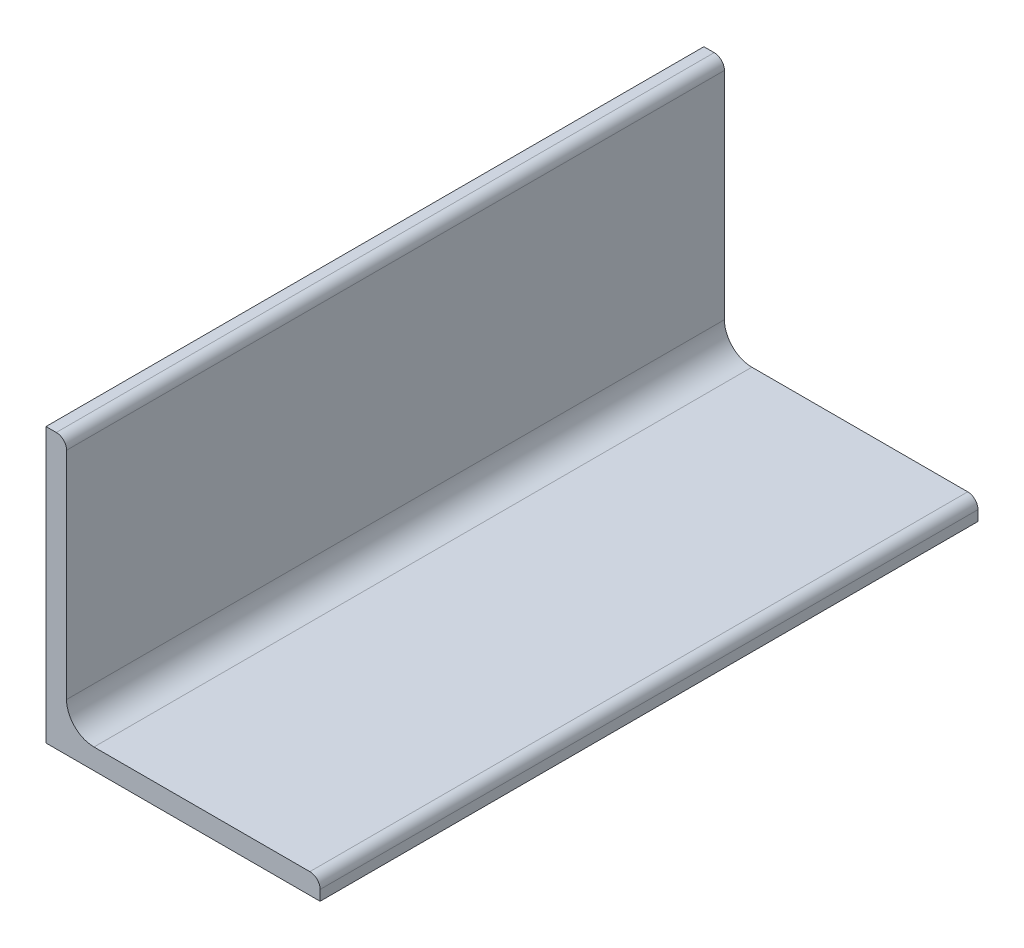
ISO-10303-21;
HEADER;
FILE_DESCRIPTION(('STEP AP214'),'2;1');
FILE_NAME('part.step','',(''),(''),'','','');
FILE_SCHEMA(('AUTOMOTIVE_DESIGN { 1 0 10303 214 1 1 1 1 }'));
ENDSEC;
DATA;
#1=APPLICATION_CONTEXT('core data for automotive mechanical design processes');
#2=APPLICATION_PROTOCOL_DEFINITION('international standard','automotive_design',2000,#1);
#3=PRODUCT_CONTEXT('',#1,'mechanical');
#4=PRODUCT('Part','Part','',(#3));
#5=PRODUCT_RELATED_PRODUCT_CATEGORY('part','',(#4));
#6=PRODUCT_DEFINITION_FORMATION('','',#4);
#7=PRODUCT_DEFINITION_CONTEXT('part definition',#1,'design');
#8=PRODUCT_DEFINITION('design','',#6,#7);
#9=PRODUCT_DEFINITION_SHAPE('','',#8);
#10=(LENGTH_UNIT() NAMED_UNIT(*) SI_UNIT(.MILLI.,.METRE.));
#11=(NAMED_UNIT(*) PLANE_ANGLE_UNIT() SI_UNIT($,.RADIAN.));
#12=(NAMED_UNIT(*) SI_UNIT($,.STERADIAN.) SOLID_ANGLE_UNIT());
#13=UNCERTAINTY_MEASURE_WITH_UNIT(LENGTH_MEASURE(1.E-05),#10,'distance_accuracy_value','');
#14=(GEOMETRIC_REPRESENTATION_CONTEXT(3) GLOBAL_UNCERTAINTY_ASSIGNED_CONTEXT((#13)) GLOBAL_UNIT_ASSIGNED_CONTEXT((#10,
#11,#12)) REPRESENTATION_CONTEXT('',''));
#15=CARTESIAN_POINT('',(0.,0.,0.));
#16=DIRECTION('',(0.,0.,1.));
#17=DIRECTION('',(1.,0.,0.));
#18=AXIS2_PLACEMENT_3D('',#15,#16,#17);
#19=CARTESIAN_POINT('',(0.0507450451214936,127.041655270204,304.8));
#20=DIRECTION('',(1.,0.,0.));
#21=DIRECTION('',(0.,0.,-1.));
#22=AXIS2_PLACEMENT_3D('',#19,#20,#21);
#23=PLANE('',#22);
#24=DIRECTION('',(0.,-1.,0.));
#25=VECTOR('',#24,1.);
#26=CARTESIAN_POINT('',(0.0507450451214936,127.041655270204,0.));
#27=LINE('',#26,#25);
#28=CARTESIAN_POINT('',(0.0507450451214936,127.041655270204,0.));
#29=VERTEX_POINT('',#28);
#30=CARTESIAN_POINT('',(0.0507450451214936,0.0416552702040917,0.));
#31=VERTEX_POINT('',#30);
#32=EDGE_CURVE('E135',#29,#31,#27,.T.);
#33=ORIENTED_EDGE('',*,*,#32,.T.);
#34=DIRECTION('',(0.,0.,-1.));
#35=VECTOR('',#34,1.);
#36=CARTESIAN_POINT('',(0.0507450451214936,0.0416552702040917,304.8));
#37=LINE('',#36,#35);
#38=CARTESIAN_POINT('',(0.0507450451214936,0.0416552702040917,304.8));
#39=VERTEX_POINT('',#38);
#40=EDGE_CURVE('E11',#39,#31,#37,.T.);
#41=ORIENTED_EDGE('',*,*,#40,.F.);
#42=DIRECTION('',(0.,-1.,0.));
#43=VECTOR('',#42,1.);
#44=CARTESIAN_POINT('',(0.0507450451214936,127.041655270204,304.8));
#45=LINE('',#44,#43);
#46=CARTESIAN_POINT('',(0.0507450451214936,127.041655270204,304.8));
#47=VERTEX_POINT('',#46);
#48=EDGE_CURVE('E151',#47,#39,#45,.T.);
#49=ORIENTED_EDGE('',*,*,#48,.F.);
#50=DIRECTION('',(0.,0.,-1.));
#51=VECTOR('',#50,1.);
#52=CARTESIAN_POINT('',(0.0507450451214936,127.041655270204,304.8));
#53=LINE('',#52,#51);
#54=EDGE_CURVE('E131',#47,#29,#53,.T.);
#55=ORIENTED_EDGE('',*,*,#54,.T.);
#56=EDGE_LOOP('',(#33,#41,#49,#55));
#57=FACE_BOUND('',#56,.T.);
#58=ADVANCED_FACE('F33',(#57),#23,.F.);
#59=CARTESIAN_POINT('',(0.0507450451214936,0.0416552702040917,304.8));
#60=DIRECTION('',(0.,1.,0.));
#61=DIRECTION('',(0.,0.,1.));
#62=AXIS2_PLACEMENT_3D('',#59,#60,#61);
#63=PLANE('',#62);
#64=DIRECTION('',(1.,0.,0.));
#65=VECTOR('',#64,1.);
#66=CARTESIAN_POINT('',(0.0507450451214936,0.0416552702040917,0.));
#67=LINE('',#66,#65);
#68=CARTESIAN_POINT('',(127.050745045121,0.0416552702040917,0.));
#69=VERTEX_POINT('',#68);
#70=EDGE_CURVE('E138',#31,#69,#67,.T.);
#71=ORIENTED_EDGE('',*,*,#70,.T.);
#72=DIRECTION('',(0.,0.,-1.));
#73=VECTOR('',#72,1.);
#74=CARTESIAN_POINT('',(127.050745045121,0.0416552702040917,304.8));
#75=LINE('',#74,#73);
#76=CARTESIAN_POINT('',(127.050745045121,0.0416552702040917,304.8));
#77=VERTEX_POINT('',#76);
#78=EDGE_CURVE('E41',#77,#69,#75,.T.);
#79=ORIENTED_EDGE('',*,*,#78,.F.);
#80=DIRECTION('',(1.,0.,0.));
#81=VECTOR('',#80,1.);
#82=CARTESIAN_POINT('',(0.0507450451214936,0.0416552702040917,304.8));
#83=LINE('',#82,#81);
#84=EDGE_CURVE('E95',#39,#77,#83,.T.);
#85=ORIENTED_EDGE('',*,*,#84,.F.);
#86=ORIENTED_EDGE('',*,*,#40,.T.);
#87=EDGE_LOOP('',(#71,#79,#85,#86));
#88=FACE_BOUND('',#87,.T.);
#89=ADVANCED_FACE('F194',(#88),#63,.F.);
#90=CARTESIAN_POINT('',(127.050745045121,0.0416552702040917,304.8));
#91=DIRECTION('',(-1.,0.,0.));
#92=DIRECTION('',(0.,0.,1.));
#93=AXIS2_PLACEMENT_3D('',#90,#91,#92);
#94=PLANE('',#93);
#95=DIRECTION('',(0.,1.,0.));
#96=VECTOR('',#95,1.);
#97=CARTESIAN_POINT('',(127.050745045121,0.0416552702040917,0.));
#98=LINE('',#97,#96);
#99=CARTESIAN_POINT('',(127.050745045121,4.80415527020409,0.));
#100=VERTEX_POINT('',#99);
#101=EDGE_CURVE('E140',#69,#100,#98,.T.);
#102=ORIENTED_EDGE('',*,*,#101,.T.);
#103=DIRECTION('',(0.,0.,-1.));
#104=VECTOR('',#103,1.);
#105=CARTESIAN_POINT('',(127.050745045121,4.80415527020409,304.8));
#106=LINE('',#105,#104);
#107=CARTESIAN_POINT('',(127.050745045121,4.80415527020409,304.8));
#108=VERTEX_POINT('',#107);
#109=EDGE_CURVE('E161',#108,#100,#106,.T.);
#110=ORIENTED_EDGE('',*,*,#109,.F.);
#111=DIRECTION('',(0.,1.,0.));
#112=VECTOR('',#111,1.);
#113=CARTESIAN_POINT('',(127.050745045121,0.0416552702040917,304.8));
#114=LINE('',#113,#112);
#115=EDGE_CURVE('E169',#77,#108,#114,.T.);
#116=ORIENTED_EDGE('',*,*,#115,.F.);
#117=ORIENTED_EDGE('',*,*,#78,.T.);
#118=EDGE_LOOP('',(#102,#110,#116,#117));
#119=FACE_BOUND('',#118,.T.);
#120=ADVANCED_FACE('F167',(#119),#94,.F.);
#121=CARTESIAN_POINT('',(122.288245045121,4.80415527020409,304.8));
#122=DIRECTION('',(0.,0.,-1.));
#123=DIRECTION('',(-1.,0.,0.));
#124=AXIS2_PLACEMENT_3D('',#121,#122,#123);
#125=CYLINDRICAL_SURFACE('',#124,4.7625);
#126=CARTESIAN_POINT('',(122.288245045121,4.80415527020409,0.));
#127=DIRECTION('',(0.,0.,1.));
#128=DIRECTION('',(1.,0.,0.));
#129=AXIS2_PLACEMENT_3D('',#126,#127,#128);
#130=CIRCLE('',#129,4.7625);
#131=CARTESIAN_POINT('',(122.288245045121,9.56665527020409,0.));
#132=VERTEX_POINT('',#131);
#133=EDGE_CURVE('E142',#100,#132,#130,.T.);
#134=ORIENTED_EDGE('',*,*,#133,.T.);
#135=DIRECTION('',(0.,0.,-1.));
#136=VECTOR('',#135,1.);
#137=CARTESIAN_POINT('',(122.288245045121,9.56665527020409,304.8));
#138=LINE('',#137,#136);
#139=CARTESIAN_POINT('',(122.288245045121,9.56665527020409,304.8));
#140=VERTEX_POINT('',#139);
#141=EDGE_CURVE('E158',#140,#132,#138,.T.);
#142=ORIENTED_EDGE('',*,*,#141,.F.);
#143=CARTESIAN_POINT('',(122.288245045121,4.80415527020409,304.8));
#144=DIRECTION('',(0.,0.,1.));
#145=DIRECTION('',(1.,0.,0.));
#146=AXIS2_PLACEMENT_3D('',#143,#144,#145);
#147=CIRCLE('',#146,4.7625);
#148=EDGE_CURVE('E185',#108,#140,#147,.T.);
#149=ORIENTED_EDGE('',*,*,#148,.F.);
#150=ORIENTED_EDGE('',*,*,#109,.T.);
#151=EDGE_LOOP('',(#134,#142,#149,#150));
#152=FACE_BOUND('',#151,.T.);
#153=ADVANCED_FACE('F178',(#152),#125,.T.);
#154=CARTESIAN_POINT('',(122.288245045121,9.56665527020409,304.8));
#155=DIRECTION('',(0.,-1.,0.));
#156=DIRECTION('',(0.,0.,-1.));
#157=AXIS2_PLACEMENT_3D('',#154,#155,#156);
#158=PLANE('',#157);
#159=DIRECTION('',(-1.,0.,0.));
#160=VECTOR('',#159,1.);
#161=CARTESIAN_POINT('',(122.288245045121,9.56665527020409,0.));
#162=LINE('',#161,#160);
#163=CARTESIAN_POINT('',(22.2757450451215,9.56665527020409,0.));
#164=VERTEX_POINT('',#163);
#165=EDGE_CURVE('E144',#132,#164,#162,.T.);
#166=ORIENTED_EDGE('',*,*,#165,.T.);
#167=DIRECTION('',(0.,0.,-1.));
#168=VECTOR('',#167,1.);
#169=CARTESIAN_POINT('',(22.2757450451215,9.56665527020409,304.8));
#170=LINE('',#169,#168);
#171=CARTESIAN_POINT('',(22.2757450451215,9.56665527020409,304.8));
#172=VERTEX_POINT('',#171);
#173=EDGE_CURVE('E155',#172,#164,#170,.T.);
#174=ORIENTED_EDGE('',*,*,#173,.F.);
#175=DIRECTION('',(-1.,0.,0.));
#176=VECTOR('',#175,1.);
#177=CARTESIAN_POINT('',(122.288245045121,9.56665527020409,304.8));
#178=LINE('',#177,#176);
#179=EDGE_CURVE('E184',#140,#172,#178,.T.);
#180=ORIENTED_EDGE('',*,*,#179,.F.);
#181=ORIENTED_EDGE('',*,*,#141,.T.);
#182=EDGE_LOOP('',(#166,#174,#180,#181));
#183=FACE_BOUND('',#182,.T.);
#184=ADVANCED_FACE('F182',(#183),#158,.F.);
#185=CARTESIAN_POINT('',(22.2757450451215,22.2666552702041,304.8));
#186=DIRECTION('',(0.,0.,-1.));
#187=DIRECTION('',(-1.,0.,0.));
#188=AXIS2_PLACEMENT_3D('',#185,#186,#187);
#189=CYLINDRICAL_SURFACE('',#188,12.7);
#190=CARTESIAN_POINT('',(22.2757450451215,22.2666552702041,0.));
#191=DIRECTION('',(0.,0.,-1.));
#192=DIRECTION('',(1.,0.,0.));
#193=AXIS2_PLACEMENT_3D('',#190,#191,#192);
#194=CIRCLE('',#193,12.7);
#195=CARTESIAN_POINT('',(9.57574504512149,22.2666552702041,0.));
#196=VERTEX_POINT('',#195);
#197=EDGE_CURVE('E146',#164,#196,#194,.T.);
#198=ORIENTED_EDGE('',*,*,#197,.T.);
#199=DIRECTION('',(0.,0.,-1.));
#200=VECTOR('',#199,1.);
#201=CARTESIAN_POINT('',(9.57574504512149,22.2666552702041,304.8));
#202=LINE('',#201,#200);
#203=CARTESIAN_POINT('',(9.57574504512149,22.2666552702041,304.8));
#204=VERTEX_POINT('',#203);
#205=EDGE_CURVE('E126',#204,#196,#202,.T.);
#206=ORIENTED_EDGE('',*,*,#205,.F.);
#207=CARTESIAN_POINT('',(22.2757450451215,22.2666552702041,304.8));
#208=DIRECTION('',(0.,0.,-1.));
#209=DIRECTION('',(1.,0.,0.));
#210=AXIS2_PLACEMENT_3D('',#207,#208,#209);
#211=CIRCLE('',#210,12.7);
#212=EDGE_CURVE('E117',#172,#204,#211,.T.);
#213=ORIENTED_EDGE('',*,*,#212,.F.);
#214=ORIENTED_EDGE('',*,*,#173,.T.);
#215=EDGE_LOOP('',(#198,#206,#213,#214));
#216=FACE_BOUND('',#215,.T.);
#217=ADVANCED_FACE('F206',(#216),#189,.F.);
#218=CARTESIAN_POINT('',(9.57574504512149,22.2666552702041,304.8));
#219=DIRECTION('',(-1.,0.,0.));
#220=DIRECTION('',(0.,0.,1.));
#221=AXIS2_PLACEMENT_3D('',#218,#219,#220);
#222=PLANE('',#221);
#223=DIRECTION('',(0.,1.,0.));
#224=VECTOR('',#223,1.);
#225=CARTESIAN_POINT('',(9.57574504512149,22.2666552702041,0.));
#226=LINE('',#225,#224);
#227=CARTESIAN_POINT('',(9.57574504512149,122.279155270204,0.));
#228=VERTEX_POINT('',#227);
#229=EDGE_CURVE('E125',#196,#228,#226,.T.);
#230=ORIENTED_EDGE('',*,*,#229,.T.);
#231=DIRECTION('',(0.,0.,-1.));
#232=VECTOR('',#231,1.);
#233=CARTESIAN_POINT('',(9.57574504512149,122.279155270204,304.8));
#234=LINE('',#233,#232);
#235=CARTESIAN_POINT('',(9.57574504512149,122.279155270204,304.8));
#236=VERTEX_POINT('',#235);
#237=EDGE_CURVE('E122',#236,#228,#234,.T.);
#238=ORIENTED_EDGE('',*,*,#237,.F.);
#239=DIRECTION('',(0.,1.,0.));
#240=VECTOR('',#239,1.);
#241=CARTESIAN_POINT('',(9.57574504512149,22.2666552702041,304.8));
#242=LINE('',#241,#240);
#243=EDGE_CURVE('E111',#204,#236,#242,.T.);
#244=ORIENTED_EDGE('',*,*,#243,.F.);
#245=ORIENTED_EDGE('',*,*,#205,.T.);
#246=EDGE_LOOP('',(#230,#238,#244,#245));
#247=FACE_BOUND('',#246,.T.);
#248=ADVANCED_FACE('F123',(#247),#222,.F.);
#249=CARTESIAN_POINT('',(4.8132450451215,122.279155270204,304.8));
#250=DIRECTION('',(0.,0.,-1.));
#251=DIRECTION('',(-1.,0.,0.));
#252=AXIS2_PLACEMENT_3D('',#249,#250,#251);
#253=CYLINDRICAL_SURFACE('',#252,4.7625);
#254=CARTESIAN_POINT('',(4.8132450451215,122.279155270204,0.));
#255=DIRECTION('',(0.,0.,1.));
#256=DIRECTION('',(1.,0.,0.));
#257=AXIS2_PLACEMENT_3D('',#254,#255,#256);
#258=CIRCLE('',#257,4.7625);
#259=CARTESIAN_POINT('',(4.8132450451215,127.041655270204,0.));
#260=VERTEX_POINT('',#259);
#261=EDGE_CURVE('E81',#228,#260,#258,.T.);
#262=ORIENTED_EDGE('',*,*,#261,.T.);
#263=DIRECTION('',(0.,0.,-1.));
#264=VECTOR('',#263,1.);
#265=CARTESIAN_POINT('',(4.8132450451215,127.041655270204,304.8));
#266=LINE('',#265,#264);
#267=CARTESIAN_POINT('',(4.8132450451215,127.041655270204,304.8));
#268=VERTEX_POINT('',#267);
#269=EDGE_CURVE('E127',#268,#260,#266,.T.);
#270=ORIENTED_EDGE('',*,*,#269,.F.);
#271=CARTESIAN_POINT('',(4.8132450451215,122.279155270204,304.8));
#272=DIRECTION('',(0.,0.,1.));
#273=DIRECTION('',(1.,0.,0.));
#274=AXIS2_PLACEMENT_3D('',#271,#272,#273);
#275=CIRCLE('',#274,4.7625);
#276=EDGE_CURVE('E115',#236,#268,#275,.T.);
#277=ORIENTED_EDGE('',*,*,#276,.F.);
#278=ORIENTED_EDGE('',*,*,#237,.T.);
#279=EDGE_LOOP('',(#262,#270,#277,#278));
#280=FACE_BOUND('',#279,.T.);
#281=ADVANCED_FACE('F129',(#280),#253,.T.);
#282=CARTESIAN_POINT('',(4.81324504512149,127.041655270204,304.8));
#283=DIRECTION('',(0.,-1.,0.));
#284=DIRECTION('',(0.,0.,-1.));
#285=AXIS2_PLACEMENT_3D('',#282,#283,#284);
#286=PLANE('',#285);
#287=DIRECTION('',(-1.,0.,0.));
#288=VECTOR('',#287,1.);
#289=CARTESIAN_POINT('',(4.81324504512149,127.041655270204,0.));
#290=LINE('',#289,#288);
#291=EDGE_CURVE('E87',#260,#29,#290,.T.);
#292=ORIENTED_EDGE('',*,*,#291,.T.);
#293=ORIENTED_EDGE('',*,*,#54,.F.);
#294=DIRECTION('',(-1.,0.,0.));
#295=VECTOR('',#294,1.);
#296=CARTESIAN_POINT('',(4.81324504512149,127.041655270204,304.8));
#297=LINE('',#296,#295);
#298=EDGE_CURVE('E49',#268,#47,#297,.T.);
#299=ORIENTED_EDGE('',*,*,#298,.F.);
#300=ORIENTED_EDGE('',*,*,#269,.T.);
#301=EDGE_LOOP('',(#292,#293,#299,#300));
#302=FACE_BOUND('',#301,.T.);
#303=ADVANCED_FACE('F214',(#302),#286,.F.);
#304=CARTESIAN_POINT('',(122.288245045121,4.80415527020409,304.8));
#305=DIRECTION('',(0.,0.,1.));
#306=DIRECTION('',(1.,0.,0.));
#307=AXIS2_PLACEMENT_3D('',#304,#305,#306);
#308=PLANE('',#307);
#309=ORIENTED_EDGE('',*,*,#48,.T.);
#310=ORIENTED_EDGE('',*,*,#84,.T.);
#311=ORIENTED_EDGE('',*,*,#115,.T.);
#312=ORIENTED_EDGE('',*,*,#148,.T.);
#313=ORIENTED_EDGE('',*,*,#179,.T.);
#314=ORIENTED_EDGE('',*,*,#212,.T.);
#315=ORIENTED_EDGE('',*,*,#243,.T.);
#316=ORIENTED_EDGE('',*,*,#276,.T.);
#317=ORIENTED_EDGE('',*,*,#298,.T.);
#318=EDGE_LOOP('',(#309,#310,#311,#312,#313,#314,#315,#316,#317));
#319=FACE_BOUND('',#318,.T.);
#320=ADVANCED_FACE('F113',(#319),#308,.T.);
#321=CARTESIAN_POINT('',(122.288245045121,4.80415527020409,0.));
#322=DIRECTION('',(0.,0.,1.));
#323=DIRECTION('',(1.,0.,0.));
#324=AXIS2_PLACEMENT_3D('',#321,#322,#323);
#325=PLANE('',#324);
#326=ORIENTED_EDGE('',*,*,#32,.F.);
#327=ORIENTED_EDGE('',*,*,#291,.F.);
#328=ORIENTED_EDGE('',*,*,#261,.F.);
#329=ORIENTED_EDGE('',*,*,#229,.F.);
#330=ORIENTED_EDGE('',*,*,#197,.F.);
#331=ORIENTED_EDGE('',*,*,#165,.F.);
#332=ORIENTED_EDGE('',*,*,#133,.F.);
#333=ORIENTED_EDGE('',*,*,#101,.F.);
#334=ORIENTED_EDGE('',*,*,#70,.F.);
#335=EDGE_LOOP('',(#326,#327,#328,#329,#330,#331,#332,#333,#334));
#336=FACE_BOUND('',#335,.T.);
#337=ADVANCED_FACE('F173',(#336),#325,.F.);
#338=CLOSED_SHELL('',(#58,#89,#120,#153,#184,#217,#248,#281,#303,#320,#337));
#339=MANIFOLD_SOLID_BREP('B2',#338);
#340=ADVANCED_BREP_SHAPE_REPRESENTATION('',(#18,#339),#14);
#341=SHAPE_DEFINITION_REPRESENTATION(#9,#340);
ENDSEC;
END-ISO-10303-21;
